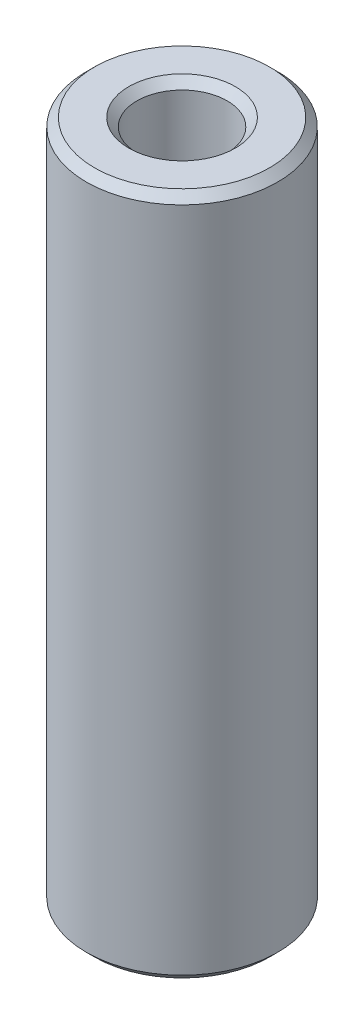
ISO-10303-21;
HEADER;
FILE_DESCRIPTION(('STEP AP214'),'2;1');
FILE_NAME('part.step','',(''),(''),'','','');
FILE_SCHEMA(('AUTOMOTIVE_DESIGN { 1 0 10303 214 1 1 1 1 }'));
ENDSEC;
DATA;
#1=APPLICATION_CONTEXT('core data for automotive mechanical design processes');
#2=APPLICATION_PROTOCOL_DEFINITION('international standard','automotive_design',2000,#1);
#3=PRODUCT_CONTEXT('',#1,'mechanical');
#4=PRODUCT('Part','Part','',(#3));
#5=PRODUCT_RELATED_PRODUCT_CATEGORY('part','',(#4));
#6=PRODUCT_DEFINITION_FORMATION('','',#4);
#7=PRODUCT_DEFINITION_CONTEXT('part definition',#1,'design');
#8=PRODUCT_DEFINITION('design','',#6,#7);
#9=PRODUCT_DEFINITION_SHAPE('','',#8);
#10=(LENGTH_UNIT() NAMED_UNIT(*) SI_UNIT(.MILLI.,.METRE.));
#11=(NAMED_UNIT(*) PLANE_ANGLE_UNIT() SI_UNIT($,.RADIAN.));
#12=(NAMED_UNIT(*) SI_UNIT($,.STERADIAN.) SOLID_ANGLE_UNIT());
#13=UNCERTAINTY_MEASURE_WITH_UNIT(LENGTH_MEASURE(1.E-05),#10,'distance_accuracy_value','');
#14=(GEOMETRIC_REPRESENTATION_CONTEXT(3) GLOBAL_UNCERTAINTY_ASSIGNED_CONTEXT((#13)) GLOBAL_UNIT_ASSIGNED_CONTEXT((#10,
#11,#12)) REPRESENTATION_CONTEXT('',''));
#15=CARTESIAN_POINT('',(0.,0.,0.));
#16=DIRECTION('',(0.,0.,1.));
#17=DIRECTION('',(1.,0.,0.));
#18=AXIS2_PLACEMENT_3D('',#15,#16,#17);
#19=CARTESIAN_POINT('',(0.,25.,0.));
#20=DIRECTION('',(0.,-1.,0.));
#21=DIRECTION('',(0.,0.,-1.));
#22=AXIS2_PLACEMENT_3D('',#19,#20,#21);
#23=CYLINDRICAL_SURFACE('',#22,3.5);
#24=CARTESIAN_POINT('',(0.,0.299999999999998,0.));
#25=DIRECTION('',(0.,1.,0.));
#26=DIRECTION('',(0.,0.,1.));
#27=AXIS2_PLACEMENT_3D('',#24,#25,#26);
#28=CIRCLE('',#27,3.5);
#29=CARTESIAN_POINT('',(0.,0.299999999999998,3.5));
#30=VERTEX_POINT('',#29);
#31=EDGE_CURVE('E71',#30,#30,#28,.T.);
#32=ORIENTED_EDGE('',*,*,#31,.T.);
#33=EDGE_LOOP('',(#32));
#34=FACE_BOUND('',#33,.T.);
#35=CARTESIAN_POINT('',(0.,24.7,0.));
#36=DIRECTION('',(0.,1.,0.));
#37=DIRECTION('',(0.,0.,1.));
#38=AXIS2_PLACEMENT_3D('',#35,#36,#37);
#39=CIRCLE('',#38,3.5);
#40=CARTESIAN_POINT('',(0.,24.7,3.5));
#41=VERTEX_POINT('',#40);
#42=EDGE_CURVE('E66',#41,#41,#39,.F.);
#43=ORIENTED_EDGE('',*,*,#42,.T.);
#44=EDGE_LOOP('',(#43));
#45=FACE_BOUND('',#44,.T.);
#46=ADVANCED_FACE('F38',(#34,#45),#23,.T.);
#47=CARTESIAN_POINT('',(0.,25.,0.));
#48=DIRECTION('',(0.,1.,0.));
#49=DIRECTION('',(0.,0.,1.));
#50=AXIS2_PLACEMENT_3D('',#47,#48,#49);
#51=PLANE('',#50);
#52=CARTESIAN_POINT('',(0.,25.,0.));
#53=DIRECTION('',(0.,1.,0.));
#54=DIRECTION('',(0.,0.,1.));
#55=AXIS2_PLACEMENT_3D('',#52,#53,#54);
#56=CIRCLE('',#55,3.20000000000001);
#57=CARTESIAN_POINT('',(0.,25.,3.20000000000001));
#58=VERTEX_POINT('',#57);
#59=EDGE_CURVE('E47',#58,#58,#56,.T.);
#60=ORIENTED_EDGE('',*,*,#59,.T.);
#61=EDGE_LOOP('',(#60));
#62=FACE_BOUND('',#61,.T.);
#63=CARTESIAN_POINT('',(0.,25.,0.));
#64=DIRECTION('',(0.,1.,0.));
#65=DIRECTION('',(0.,0.,1.));
#66=AXIS2_PLACEMENT_3D('',#63,#64,#65);
#67=CIRCLE('',#66,1.95);
#68=CARTESIAN_POINT('',(0.,25.,1.95));
#69=VERTEX_POINT('',#68);
#70=EDGE_CURVE('E83',#69,#69,#67,.F.);
#71=ORIENTED_EDGE('',*,*,#70,.T.);
#72=EDGE_LOOP('',(#71));
#73=FACE_BOUND('',#72,.T.);
#74=ADVANCED_FACE('F88',(#62,#73),#51,.T.);
#75=CARTESIAN_POINT('',(0.,0.,0.));
#76=DIRECTION('',(0.,1.,0.));
#77=DIRECTION('',(0.,0.,1.));
#78=AXIS2_PLACEMENT_3D('',#75,#76,#77);
#79=PLANE('',#78);
#80=CARTESIAN_POINT('',(0.,0.,0.));
#81=DIRECTION('',(0.,1.,0.));
#82=DIRECTION('',(0.,0.,1.));
#83=AXIS2_PLACEMENT_3D('',#80,#81,#82);
#84=CIRCLE('',#83,3.2);
#85=CARTESIAN_POINT('',(0.,0.,3.2));
#86=VERTEX_POINT('',#85);
#87=EDGE_CURVE('E77',#86,#86,#84,.F.);
#88=ORIENTED_EDGE('',*,*,#87,.T.);
#89=EDGE_LOOP('',(#88));
#90=FACE_BOUND('',#89,.T.);
#91=CARTESIAN_POINT('',(0.,0.,0.));
#92=DIRECTION('',(0.,1.,0.));
#93=DIRECTION('',(0.,0.,1.));
#94=AXIS2_PLACEMENT_3D('',#91,#92,#93);
#95=CIRCLE('',#94,1.95);
#96=CARTESIAN_POINT('',(0.,0.,1.95));
#97=VERTEX_POINT('',#96);
#98=EDGE_CURVE('E74',#97,#97,#95,.T.);
#99=ORIENTED_EDGE('',*,*,#98,.T.);
#100=EDGE_LOOP('',(#99));
#101=FACE_BOUND('',#100,.T.);
#102=ADVANCED_FACE('F111',(#90,#101),#79,.F.);
#103=CARTESIAN_POINT('',(0.,10.,0.));
#104=DIRECTION('',(0.,-1.,0.));
#105=DIRECTION('',(0.,0.,-1.));
#106=AXIS2_PLACEMENT_3D('',#103,#104,#105);
#107=CONICAL_SURFACE('',#106,1.65,1.02974425867665);
#108=CARTESIAN_POINT('',(0.,10.9914200213955,0.));
#109=VERTEX_POINT('',#108);
#110=VERTEX_LOOP('',#109);
#111=FACE_BOUND('',#110,.T.);
#112=CARTESIAN_POINT('',(0.,10.,0.));
#113=DIRECTION('',(0.,-1.,0.));
#114=DIRECTION('',(0.,0.,-1.));
#115=AXIS2_PLACEMENT_3D('',#112,#113,#114);
#116=CIRCLE('',#115,1.65);
#117=CARTESIAN_POINT('',(0.,10.,-1.65));
#118=VERTEX_POINT('',#117);
#119=EDGE_CURVE('E63',#118,#118,#116,.T.);
#120=ORIENTED_EDGE('',*,*,#119,.T.);
#121=EDGE_LOOP('',(#120));
#122=FACE_BOUND('',#121,.T.);
#123=ADVANCED_FACE('F139',(#111,#122),#107,.F.);
#124=CARTESIAN_POINT('',(0.,0.,0.));
#125=DIRECTION('',(0.,-1.,0.));
#126=DIRECTION('',(0.,0.,-1.));
#127=AXIS2_PLACEMENT_3D('',#124,#125,#126);
#128=CYLINDRICAL_SURFACE('',#127,1.65);
#129=CARTESIAN_POINT('',(0.,0.300000000000004,0.));
#130=DIRECTION('',(0.,1.,0.));
#131=DIRECTION('',(0.,0.,1.));
#132=AXIS2_PLACEMENT_3D('',#129,#130,#131);
#133=CIRCLE('',#132,1.65);
#134=CARTESIAN_POINT('',(0.,0.300000000000004,1.65));
#135=VERTEX_POINT('',#134);
#136=EDGE_CURVE('E80',#135,#135,#133,.F.);
#137=ORIENTED_EDGE('',*,*,#136,.T.);
#138=EDGE_LOOP('',(#137));
#139=FACE_BOUND('',#138,.T.);
#140=ORIENTED_EDGE('',*,*,#119,.F.);
#141=EDGE_LOOP('',(#140));
#142=FACE_BOUND('',#141,.T.);
#143=ADVANCED_FACE('F57',(#139,#142),#128,.F.);
#144=CARTESIAN_POINT('',(0.,15.,0.));
#145=DIRECTION('',(0.,1.,0.));
#146=DIRECTION('',(0.,0.,1.));
#147=AXIS2_PLACEMENT_3D('',#144,#145,#146);
#148=CONICAL_SURFACE('',#147,1.64999999999999,1.02974425867665);
#149=CARTESIAN_POINT('',(0.,14.0085799786045,0.));
#150=VERTEX_POINT('',#149);
#151=VERTEX_LOOP('',#150);
#152=FACE_BOUND('',#151,.T.);
#153=CARTESIAN_POINT('',(0.,15.,0.));
#154=DIRECTION('',(0.,1.,0.));
#155=DIRECTION('',(0.,0.,1.));
#156=AXIS2_PLACEMENT_3D('',#153,#154,#155);
#157=CIRCLE('',#156,1.64999999999999);
#158=CARTESIAN_POINT('',(0.,15.,1.64999999999999));
#159=VERTEX_POINT('',#158);
#160=EDGE_CURVE('E61',#159,#159,#157,.T.);
#161=ORIENTED_EDGE('',*,*,#160,.T.);
#162=EDGE_LOOP('',(#161));
#163=FACE_BOUND('',#162,.T.);
#164=ADVANCED_FACE('F53',(#152,#163),#148,.F.);
#165=CARTESIAN_POINT('',(0.,25.,0.));
#166=DIRECTION('',(0.,1.,0.));
#167=DIRECTION('',(0.,0.,1.));
#168=AXIS2_PLACEMENT_3D('',#165,#166,#167);
#169=CYLINDRICAL_SURFACE('',#168,1.64999999999999);
#170=CARTESIAN_POINT('',(0.,24.7,0.));
#171=DIRECTION('',(0.,1.,0.));
#172=DIRECTION('',(0.,0.,1.));
#173=AXIS2_PLACEMENT_3D('',#170,#171,#172);
#174=CIRCLE('',#173,1.64999999999999);
#175=CARTESIAN_POINT('',(0.,24.7,1.64999999999999));
#176=VERTEX_POINT('',#175);
#177=EDGE_CURVE('E11',#176,#176,#174,.T.);
#178=ORIENTED_EDGE('',*,*,#177,.T.);
#179=EDGE_LOOP('',(#178));
#180=FACE_BOUND('',#179,.T.);
#181=ORIENTED_EDGE('',*,*,#160,.F.);
#182=EDGE_LOOP('',(#181));
#183=FACE_BOUND('',#182,.T.);
#184=ADVANCED_FACE('F56',(#180,#183),#169,.F.);
#185=CARTESIAN_POINT('',(0.,0.299999999999998,0.));
#186=DIRECTION('',(0.,1.,0.));
#187=DIRECTION('',(0.,0.,1.));
#188=AXIS2_PLACEMENT_3D('',#185,#186,#187);
#189=CONICAL_SURFACE('',#188,3.5,0.785398163397449);
#190=ORIENTED_EDGE('',*,*,#87,.F.);
#191=EDGE_LOOP('',(#190));
#192=FACE_BOUND('',#191,.T.);
#193=ORIENTED_EDGE('',*,*,#31,.F.);
#194=EDGE_LOOP('',(#193));
#195=FACE_BOUND('',#194,.T.);
#196=ADVANCED_FACE('F100',(#192,#195),#189,.T.);
#197=CARTESIAN_POINT('',(0.,0.300000000000004,0.));
#198=DIRECTION('',(0.,-1.,0.));
#199=DIRECTION('',(0.,0.,-1.));
#200=AXIS2_PLACEMENT_3D('',#197,#198,#199);
#201=CONICAL_SURFACE('',#200,1.65,0.78539816339745);
#202=ORIENTED_EDGE('',*,*,#98,.F.);
#203=EDGE_LOOP('',(#202));
#204=FACE_BOUND('',#203,.T.);
#205=ORIENTED_EDGE('',*,*,#136,.F.);
#206=EDGE_LOOP('',(#205));
#207=FACE_BOUND('',#206,.T.);
#208=ADVANCED_FACE('F93',(#204,#207),#201,.F.);
#209=CARTESIAN_POINT('',(0.,25.,0.));
#210=DIRECTION('',(0.,-1.,0.));
#211=DIRECTION('',(0.,0.,-1.));
#212=AXIS2_PLACEMENT_3D('',#209,#210,#211);
#213=CONICAL_SURFACE('',#212,3.20000000000001,0.785398163397443);
#214=ORIENTED_EDGE('',*,*,#42,.F.);
#215=EDGE_LOOP('',(#214));
#216=FACE_BOUND('',#215,.T.);
#217=ORIENTED_EDGE('',*,*,#59,.F.);
#218=EDGE_LOOP('',(#217));
#219=FACE_BOUND('',#218,.T.);
#220=ADVANCED_FACE('F91',(#216,#219),#213,.T.);
#221=CARTESIAN_POINT('',(0.,24.7,0.));
#222=DIRECTION('',(0.,1.,0.));
#223=DIRECTION('',(0.,0.,1.));
#224=AXIS2_PLACEMENT_3D('',#221,#222,#223);
#225=CONICAL_SURFACE('',#224,1.64999999999999,0.785398163397447);
#226=ORIENTED_EDGE('',*,*,#70,.F.);
#227=EDGE_LOOP('',(#226));
#228=FACE_BOUND('',#227,.T.);
#229=ORIENTED_EDGE('',*,*,#177,.F.);
#230=EDGE_LOOP('',(#229));
#231=FACE_BOUND('',#230,.T.);
#232=ADVANCED_FACE('F41',(#228,#231),#225,.F.);
#233=CLOSED_SHELL('',(#46,#74,#102,#123,#143,#164,#184,#196,#208,#220,#232));
#234=MANIFOLD_SOLID_BREP('B2',#233);
#235=ADVANCED_BREP_SHAPE_REPRESENTATION('',(#18,#234),#14);
#236=SHAPE_DEFINITION_REPRESENTATION(#9,#235);
ENDSEC;
END-ISO-10303-21;
